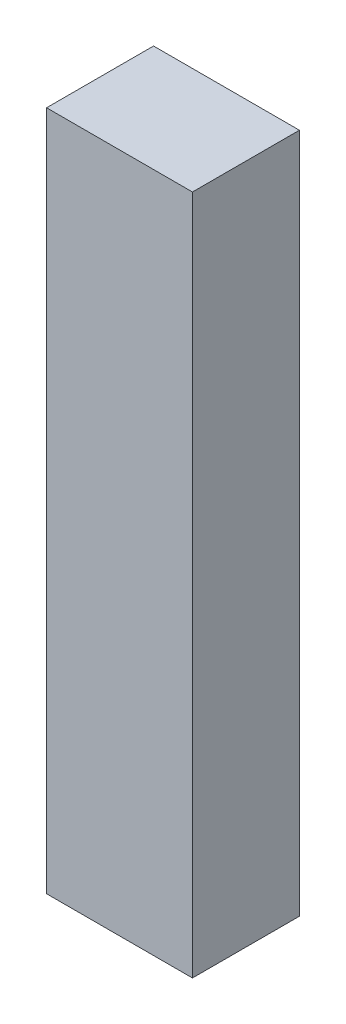
ISO-10303-21;
HEADER;
FILE_DESCRIPTION(('STEP AP214'),'2;1');
FILE_NAME('part.step','',(''),(''),'','','');
FILE_SCHEMA(('AUTOMOTIVE_DESIGN { 1 0 10303 214 1 1 1 1 }'));
ENDSEC;
DATA;
#1=APPLICATION_CONTEXT('core data for automotive mechanical design processes');
#2=APPLICATION_PROTOCOL_DEFINITION('international standard','automotive_design',2000,#1);
#3=PRODUCT_CONTEXT('',#1,'mechanical');
#4=PRODUCT('Part','Part','',(#3));
#5=PRODUCT_RELATED_PRODUCT_CATEGORY('part','',(#4));
#6=PRODUCT_DEFINITION_FORMATION('','',#4);
#7=PRODUCT_DEFINITION_CONTEXT('part definition',#1,'design');
#8=PRODUCT_DEFINITION('design','',#6,#7);
#9=PRODUCT_DEFINITION_SHAPE('','',#8);
#10=(LENGTH_UNIT() NAMED_UNIT(*) SI_UNIT(.MILLI.,.METRE.));
#11=(NAMED_UNIT(*) PLANE_ANGLE_UNIT() SI_UNIT($,.RADIAN.));
#12=(NAMED_UNIT(*) SI_UNIT($,.STERADIAN.) SOLID_ANGLE_UNIT());
#13=UNCERTAINTY_MEASURE_WITH_UNIT(LENGTH_MEASURE(1.E-05),#10,'distance_accuracy_value','');
#14=(GEOMETRIC_REPRESENTATION_CONTEXT(3) GLOBAL_UNCERTAINTY_ASSIGNED_CONTEXT((#13)) GLOBAL_UNIT_ASSIGNED_CONTEXT((#10,
#11,#12)) REPRESENTATION_CONTEXT('',''));
#15=CARTESIAN_POINT('',(0.,0.,0.));
#16=DIRECTION('',(0.,0.,1.));
#17=DIRECTION('',(1.,0.,0.));
#18=AXIS2_PLACEMENT_3D('',#15,#16,#17);
#19=CARTESIAN_POINT('',(0.,0.,55.));
#20=DIRECTION('',(0.,1.,0.));
#21=DIRECTION('',(0.,0.,1.));
#22=AXIS2_PLACEMENT_3D('',#19,#20,#21);
#23=PLANE('',#22);
#24=DIRECTION('',(1.,0.,0.));
#25=VECTOR('',#24,1.);
#26=CARTESIAN_POINT('',(0.,0.,0.));
#27=LINE('',#26,#25);
#28=CARTESIAN_POINT('',(-75.,0.,0.));
#29=VERTEX_POINT('',#28);
#30=CARTESIAN_POINT('',(0.,0.,0.));
#31=VERTEX_POINT('',#30);
#32=EDGE_CURVE('E102',#29,#31,#27,.T.);
#33=ORIENTED_EDGE('',*,*,#32,.T.);
#34=DIRECTION('',(0.,0.,-1.));
#35=VECTOR('',#34,1.);
#36=CARTESIAN_POINT('',(0.,0.,55.));
#37=LINE('',#36,#35);
#38=CARTESIAN_POINT('',(0.,0.,55.));
#39=VERTEX_POINT('',#38);
#40=EDGE_CURVE('E11',#39,#31,#37,.T.);
#41=ORIENTED_EDGE('',*,*,#40,.F.);
#42=DIRECTION('',(1.,0.,0.));
#43=VECTOR('',#42,1.);
#44=CARTESIAN_POINT('',(0.,0.,55.));
#45=LINE('',#44,#43);
#46=CARTESIAN_POINT('',(-75.,0.,55.));
#47=VERTEX_POINT('',#46);
#48=EDGE_CURVE('E90',#47,#39,#45,.T.);
#49=ORIENTED_EDGE('',*,*,#48,.F.);
#50=DIRECTION('',(0.,0.,-1.));
#51=VECTOR('',#50,1.);
#52=CARTESIAN_POINT('',(-75.,0.,55.));
#53=LINE('',#52,#51);
#54=EDGE_CURVE('E98',#47,#29,#53,.T.);
#55=ORIENTED_EDGE('',*,*,#54,.T.);
#56=EDGE_LOOP('',(#33,#41,#49,#55));
#57=FACE_BOUND('',#56,.T.);
#58=ADVANCED_FACE('F39',(#57),#23,.F.);
#59=CARTESIAN_POINT('',(0.,0.,55.));
#60=DIRECTION('',(-1.,0.,0.));
#61=DIRECTION('',(0.,0.,1.));
#62=AXIS2_PLACEMENT_3D('',#59,#60,#61);
#63=PLANE('',#62);
#64=DIRECTION('',(0.,1.,0.));
#65=VECTOR('',#64,1.);
#66=CARTESIAN_POINT('',(0.,0.,0.));
#67=LINE('',#66,#65);
#68=CARTESIAN_POINT('',(0.,350.,0.));
#69=VERTEX_POINT('',#68);
#70=EDGE_CURVE('E94',#31,#69,#67,.T.);
#71=ORIENTED_EDGE('',*,*,#70,.T.);
#72=DIRECTION('',(0.,0.,-1.));
#73=VECTOR('',#72,1.);
#74=CARTESIAN_POINT('',(0.,350.,55.));
#75=LINE('',#74,#73);
#76=CARTESIAN_POINT('',(0.,350.,55.));
#77=VERTEX_POINT('',#76);
#78=EDGE_CURVE('E47',#77,#69,#75,.T.);
#79=ORIENTED_EDGE('',*,*,#78,.F.);
#80=DIRECTION('',(0.,1.,0.));
#81=VECTOR('',#80,1.);
#82=CARTESIAN_POINT('',(0.,0.,55.));
#83=LINE('',#82,#81);
#84=EDGE_CURVE('E85',#39,#77,#83,.T.);
#85=ORIENTED_EDGE('',*,*,#84,.F.);
#86=ORIENTED_EDGE('',*,*,#40,.T.);
#87=EDGE_LOOP('',(#71,#79,#85,#86));
#88=FACE_BOUND('',#87,.T.);
#89=ADVANCED_FACE('F93',(#88),#63,.F.);
#90=CARTESIAN_POINT('',(0.,350.,55.));
#91=DIRECTION('',(0.,-1.,0.));
#92=DIRECTION('',(0.,0.,-1.));
#93=AXIS2_PLACEMENT_3D('',#90,#91,#92);
#94=PLANE('',#93);
#95=DIRECTION('',(-1.,0.,0.));
#96=VECTOR('',#95,1.);
#97=CARTESIAN_POINT('',(0.,350.,0.));
#98=LINE('',#97,#96);
#99=CARTESIAN_POINT('',(-75.,350.,0.));
#100=VERTEX_POINT('',#99);
#101=EDGE_CURVE('E72',#69,#100,#98,.T.);
#102=ORIENTED_EDGE('',*,*,#101,.T.);
#103=DIRECTION('',(0.,0.,-1.));
#104=VECTOR('',#103,1.);
#105=CARTESIAN_POINT('',(-75.,350.,55.));
#106=LINE('',#105,#104);
#107=CARTESIAN_POINT('',(-75.,350.,55.));
#108=VERTEX_POINT('',#107);
#109=EDGE_CURVE('E95',#108,#100,#106,.T.);
#110=ORIENTED_EDGE('',*,*,#109,.F.);
#111=DIRECTION('',(-1.,0.,0.));
#112=VECTOR('',#111,1.);
#113=CARTESIAN_POINT('',(0.,350.,55.));
#114=LINE('',#113,#112);
#115=EDGE_CURVE('E88',#77,#108,#114,.T.);
#116=ORIENTED_EDGE('',*,*,#115,.F.);
#117=ORIENTED_EDGE('',*,*,#78,.T.);
#118=EDGE_LOOP('',(#102,#110,#116,#117));
#119=FACE_BOUND('',#118,.T.);
#120=ADVANCED_FACE('F96',(#119),#94,.F.);
#121=CARTESIAN_POINT('',(-75.,0.,55.));
#122=DIRECTION('',(1.,0.,0.));
#123=DIRECTION('',(0.,0.,-1.));
#124=AXIS2_PLACEMENT_3D('',#121,#122,#123);
#125=PLANE('',#124);
#126=DIRECTION('',(0.,-1.,0.));
#127=VECTOR('',#126,1.);
#128=CARTESIAN_POINT('',(-75.,0.,0.));
#129=LINE('',#128,#127);
#130=EDGE_CURVE('E78',#100,#29,#129,.T.);
#131=ORIENTED_EDGE('',*,*,#130,.T.);
#132=ORIENTED_EDGE('',*,*,#54,.F.);
#133=DIRECTION('',(0.,-1.,0.));
#134=VECTOR('',#133,1.);
#135=CARTESIAN_POINT('',(-75.,0.,55.));
#136=LINE('',#135,#134);
#137=EDGE_CURVE('E55',#108,#47,#136,.T.);
#138=ORIENTED_EDGE('',*,*,#137,.F.);
#139=ORIENTED_EDGE('',*,*,#109,.T.);
#140=EDGE_LOOP('',(#131,#132,#138,#139));
#141=FACE_BOUND('',#140,.T.);
#142=ADVANCED_FACE('F109',(#141),#125,.F.);
#143=CARTESIAN_POINT('',(0.,0.,55.));
#144=DIRECTION('',(0.,0.,-1.));
#145=DIRECTION('',(-1.,0.,0.));
#146=AXIS2_PLACEMENT_3D('',#143,#144,#145);
#147=PLANE('',#146);
#148=ORIENTED_EDGE('',*,*,#48,.T.);
#149=ORIENTED_EDGE('',*,*,#84,.T.);
#150=ORIENTED_EDGE('',*,*,#115,.T.);
#151=ORIENTED_EDGE('',*,*,#137,.T.);
#152=EDGE_LOOP('',(#148,#149,#150,#151));
#153=FACE_BOUND('',#152,.T.);
#154=ADVANCED_FACE('F86',(#153),#147,.F.);
#155=CARTESIAN_POINT('',(0.,0.,0.));
#156=DIRECTION('',(0.,0.,-1.));
#157=DIRECTION('',(-1.,0.,0.));
#158=AXIS2_PLACEMENT_3D('',#155,#156,#157);
#159=PLANE('',#158);
#160=ORIENTED_EDGE('',*,*,#32,.F.);
#161=ORIENTED_EDGE('',*,*,#130,.F.);
#162=ORIENTED_EDGE('',*,*,#101,.F.);
#163=ORIENTED_EDGE('',*,*,#70,.F.);
#164=EDGE_LOOP('',(#160,#161,#162,#163));
#165=FACE_BOUND('',#164,.T.);
#166=ADVANCED_FACE('F112',(#165),#159,.T.);
#167=CLOSED_SHELL('',(#58,#89,#120,#142,#154,#166));
#168=MANIFOLD_SOLID_BREP('B2',#167);
#169=ADVANCED_BREP_SHAPE_REPRESENTATION('',(#18,#168),#14);
#170=SHAPE_DEFINITION_REPRESENTATION(#9,#169);
ENDSEC;
END-ISO-10303-21;
